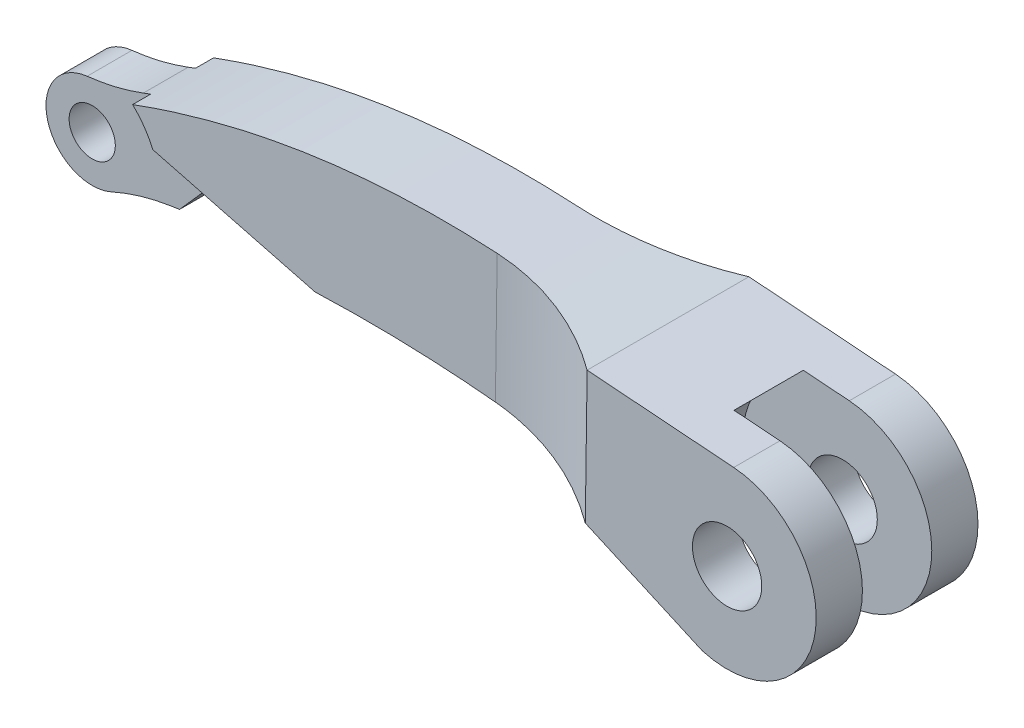
ISO-10303-21;
HEADER;
FILE_DESCRIPTION(('STEP AP214'),'2;1');
FILE_NAME('part.step','',(''),(''),'','','');
FILE_SCHEMA(('AUTOMOTIVE_DESIGN { 1 0 10303 214 1 1 1 1 }'));
ENDSEC;
DATA;
#1=APPLICATION_CONTEXT('core data for automotive mechanical design processes');
#2=APPLICATION_PROTOCOL_DEFINITION('international standard','automotive_design',2000,#1);
#3=PRODUCT_CONTEXT('',#1,'mechanical');
#4=PRODUCT('Part','Part','',(#3));
#5=PRODUCT_RELATED_PRODUCT_CATEGORY('part','',(#4));
#6=PRODUCT_DEFINITION_FORMATION('','',#4);
#7=PRODUCT_DEFINITION_CONTEXT('part definition',#1,'design');
#8=PRODUCT_DEFINITION('design','',#6,#7);
#9=PRODUCT_DEFINITION_SHAPE('','',#8);
#10=(LENGTH_UNIT() NAMED_UNIT(*) SI_UNIT(.MILLI.,.METRE.));
#11=(NAMED_UNIT(*) PLANE_ANGLE_UNIT() SI_UNIT($,.RADIAN.));
#12=(NAMED_UNIT(*) SI_UNIT($,.STERADIAN.) SOLID_ANGLE_UNIT());
#13=UNCERTAINTY_MEASURE_WITH_UNIT(LENGTH_MEASURE(1.E-05),#10,'distance_accuracy_value','');
#14=(GEOMETRIC_REPRESENTATION_CONTEXT(3) GLOBAL_UNCERTAINTY_ASSIGNED_CONTEXT((#13)) GLOBAL_UNIT_ASSIGNED_CONTEXT((#10,
#11,#12)) REPRESENTATION_CONTEXT('',''));
#15=CARTESIAN_POINT('',(0.,0.,0.));
#16=DIRECTION('',(0.,0.,1.));
#17=DIRECTION('',(1.,0.,0.));
#18=AXIS2_PLACEMENT_3D('',#15,#16,#17);
#19=CARTESIAN_POINT('',(1.43527791880468,-1.39283067735877,1.75));
#20=CARTESIAN_POINT('',(15.4492029121807,1.18573782839704,1.75));
#21=CARTESIAN_POINT('',(28.4490744755167,-2.56800117163254,1.75));
#22=B_SPLINE_CURVE_WITH_KNOTS('',2,(#19,#20,#21),.UNSPECIFIED.,.F.,.F.,(3,3),(0.,1.),.UNSPECIFIED.);
#23=DIRECTION('',(0.,0.,-1.));
#24=VECTOR('',#23,1.);
#25=SURFACE_OF_LINEAR_EXTRUSION('',#22,#24);
#26=CARTESIAN_POINT('',(1.43527791880468,-1.39283067735877,0.97));
#27=CARTESIAN_POINT('',(15.4492029121807,1.18573782839704,0.97));
#28=CARTESIAN_POINT('',(28.4490744755167,-2.56800117163254,0.97));
#29=B_SPLINE_CURVE_WITH_KNOTS('',2,(#26,#27,#28),.UNSPECIFIED.,.F.,.F.,(3,3),(0.,1.),.UNSPECIFIED.);
#30=CARTESIAN_POINT('',(8.42888479504866,-0.495717450284261,0.97));
#31=VERTEX_POINT('',#30);
#32=CARTESIAN_POINT('',(10.4244365086683,-0.386098791694974,0.97));
#33=VERTEX_POINT('',#32);
#34=EDGE_CURVE('E263',#31,#33,#29,.T.);
#35=ORIENTED_EDGE('',*,*,#34,.F.);
#36=DIRECTION('',(0.,0.,-1.));
#37=VECTOR('',#36,1.);
#38=CARTESIAN_POINT('',(8.42888479504866,-0.495717450284261,1.03));
#39=LINE('',#38,#37);
#40=CARTESIAN_POINT('',(8.42888479504866,-0.495717450284261,-0.97));
#41=VERTEX_POINT('',#40);
#42=EDGE_CURVE('E198',#31,#41,#39,.T.);
#43=ORIENTED_EDGE('',*,*,#42,.T.);
#44=CARTESIAN_POINT('',(1.43527791880468,-1.39283067735877,-0.97));
#45=CARTESIAN_POINT('',(15.4492029121807,1.18573782839704,-0.97));
#46=CARTESIAN_POINT('',(28.4490744755167,-2.56800117163254,-0.97));
#47=B_SPLINE_CURVE_WITH_KNOTS('',2,(#44,#45,#46),.UNSPECIFIED.,.F.,.F.,(3,3),(0.,1.),.UNSPECIFIED.);
#48=CARTESIAN_POINT('',(10.4244365086683,-0.386098791694975,-0.97));
#49=VERTEX_POINT('',#48);
#50=EDGE_CURVE('E209',#41,#49,#47,.T.);
#51=ORIENTED_EDGE('',*,*,#50,.T.);
#52=DIRECTION('',(0.,0.,-1.));
#53=VECTOR('',#52,1.);
#54=CARTESIAN_POINT('',(10.4244365086683,-0.386098791694975,8.2389131509684));
#55=LINE('',#54,#53);
#56=CARTESIAN_POINT('',(10.4244365086683,-0.386098791694975,-1.75));
#57=VERTEX_POINT('',#56);
#58=EDGE_CURVE('E229',#49,#57,#55,.T.);
#59=ORIENTED_EDGE('',*,*,#58,.T.);
#60=CARTESIAN_POINT('',(1.43527791880468,-1.39283067735877,-1.75));
#61=CARTESIAN_POINT('',(15.4492029121807,1.18573782839704,-1.75));
#62=CARTESIAN_POINT('',(28.4490744755167,-2.56800117163254,-1.75));
#63=B_SPLINE_CURVE_WITH_KNOTS('',2,(#60,#61,#62),.UNSPECIFIED.,.F.,.F.,(3,3),(0.,1.),.UNSPECIFIED.);
#64=CARTESIAN_POINT('',(18.2249382252607,-0.609983249100861,-1.75));
#65=VERTEX_POINT('',#64);
#66=EDGE_CURVE('E350',#57,#65,#63,.T.);
#67=ORIENTED_EDGE('',*,*,#66,.T.);
#68=CARTESIAN_POINT('',(18.2249382252607,-0.60998324910088,-1.75));
#69=CARTESIAN_POINT('',(18.5100813748935,-0.637652814010313,-1.74996571468664));
#70=CARTESIAN_POINT('',(18.794998784143,-0.667532379102233,-1.76222427364251));
#71=CARTESIAN_POINT('',(19.3622885730239,-0.731352980382945,-1.81098690911005));
#72=CARTESIAN_POINT('',(19.6446610106415,-0.765293923781831,-1.84749043178612));
#73=CARTESIAN_POINT('',(20.1979264498915,-0.836004063511133,-1.94321695448715));
#74=CARTESIAN_POINT('',(20.4689312656351,-0.872683713069182,-2.00186206267157));
#75=CARTESIAN_POINT('',(21.0046764787895,-0.94910037242713,-2.14138486287721));
#76=CARTESIAN_POINT('',(21.2694179966082,-0.988836829920536,-2.22225854538438));
#77=CARTESIAN_POINT('',(21.7349686760978,-1.0620266223372,-2.38593100039942));
#78=CARTESIAN_POINT('',(21.9373175064972,-1.09500092125032,-2.46460099010984));
#79=CARTESIAN_POINT('',(22.3362719142062,-1.16219708544243,-2.63490228385438));
#80=CARTESIAN_POINT('',(22.5328777145632,-1.19641890215405,-2.72653308370771));
#81=CARTESIAN_POINT('',(22.923368587076,-1.26646772014086,-2.92428497307736));
#82=CARTESIAN_POINT('',(23.1171238156068,-1.30231306104497,-3.03065590264019));
#83=CARTESIAN_POINT('',(23.4970840179918,-1.37459276870234,-3.25599802441865));
#84=CARTESIAN_POINT('',(23.6832880042539,-1.41102721163556,-3.37497085747705));
#85=CARTESIAN_POINT('',(23.8653099384864,-1.44756657474494,-3.50000000000636));
#86=B_SPLINE_CURVE_WITH_KNOTS('',3,(#68,#69,#70,#71,#72,#73,#74,#75,#76,#77,#78,#79,#80,#81,#82,
#83,#84,#85),.UNSPECIFIED.,.F.,.F.,(4,2,2,2,2,2,2,2,4),(0.,0.859163300575668,1.71830697567949,
2.55642429826319,3.39439054321632,4.05273130918115,4.71104647246186,5.38232695563261,
6.05369495120699),.UNSPECIFIED.);
#87=CARTESIAN_POINT('',(23.865309938476,-1.44756657482525,-3.5));
#88=VERTEX_POINT('',#87);
#89=EDGE_CURVE('E380',#65,#88,#86,.T.);
#90=ORIENTED_EDGE('',*,*,#89,.T.);
#91=DIRECTION('',(0.,0.,-1.));
#92=VECTOR('',#91,1.);
#93=CARTESIAN_POINT('',(23.865309938476,-1.44756657482525,3.5));
#94=LINE('',#93,#92);
#95=CARTESIAN_POINT('',(23.865309938476,-1.44756657482525,3.5));
#96=VERTEX_POINT('',#95);
#97=EDGE_CURVE('E344',#96,#88,#94,.T.);
#98=ORIENTED_EDGE('',*,*,#97,.F.);
#99=CARTESIAN_POINT('',(23.865309938476,-1.44756657482525,3.5));
#100=CARTESIAN_POINT('',(23.6312489811901,-1.40057307605156,3.33920757578725));
#101=CARTESIAN_POINT('',(23.390253261689,-1.35376072279584,3.18844433669338));
#102=CARTESIAN_POINT('',(22.8960566636482,-1.26127011249579,2.90793294190109));
#103=CARTESIAN_POINT('',(22.6428534281999,-1.21559207705461,2.77818886563256));
#104=CARTESIAN_POINT('',(22.1323842882194,-1.12726570964828,2.54366948807793));
#105=CARTESIAN_POINT('',(21.875373393739,-1.08457040307792,2.43835640605782));
#106=CARTESIAN_POINT('',(21.3531422895609,-1.00165956222023,2.24947957211496));
#107=CARTESIAN_POINT('',(21.0879240969148,-0.961443425800618,2.16591052306922));
#108=CARTESIAN_POINT('',(20.6108688013275,-0.892675616028555,2.03728829892872));
#109=CARTESIAN_POINT('',(20.4003013260282,-0.863521185971003,1.98780218985252));
#110=CARTESIAN_POINT('',(19.9761294526793,-0.80727194822316,1.90259590723777));
#111=CARTESIAN_POINT('',(19.7625252232467,-0.780177026703985,1.86687497245429));
#112=CARTESIAN_POINT('',(19.3289619338518,-0.727730828653767,1.80883821296601));
#113=CARTESIAN_POINT('',(19.1089604074446,-0.702424178037209,1.78679907092545));
#114=CARTESIAN_POINT('',(18.6676634066786,-0.654298432283651,1.75737237769931));
#115=CARTESIAN_POINT('',(18.4463676735896,-0.631479853798667,1.749987864115));
#116=CARTESIAN_POINT('',(18.2249382252607,-0.609983249100862,1.75));
#117=B_SPLINE_CURVE_WITH_KNOTS('',3,(#99,#100,#101,#102,#103,#104,#105,#106,#107,#108,#109,#110,
#111,#112,#113,#114,#115,#116),.UNSPECIFIED.,.F.,.F.,(4,2,2,2,2,2,2,2,4),(0.,0.863254027551366,
1.72667539651197,2.56876060100889,3.41064047036145,4.06498139485932,4.71928612764575,
5.38642495336616,6.05370204872468),.UNSPECIFIED.);
#118=CARTESIAN_POINT('',(18.2249382252607,-0.609983249100861,1.75));
#119=VERTEX_POINT('',#118);
#120=EDGE_CURVE('E388',#96,#119,#117,.T.);
#121=ORIENTED_EDGE('',*,*,#120,.T.);
#122=CARTESIAN_POINT('',(10.4244365086683,-0.386098791694974,1.75));
#123=VERTEX_POINT('',#122);
#124=EDGE_CURVE('E351',#123,#119,#22,.T.);
#125=ORIENTED_EDGE('',*,*,#124,.F.);
#126=DIRECTION('',(0.,0.,1.));
#127=VECTOR('',#126,1.);
#128=CARTESIAN_POINT('',(10.4244365086683,-0.386098791694974,-8.23891315096839));
#129=LINE('',#128,#127);
#130=EDGE_CURVE('E219',#33,#123,#129,.T.);
#131=ORIENTED_EDGE('',*,*,#130,.F.);
#132=EDGE_LOOP('',(#35,#43,#51,#59,#67,#90,#98,#121,#125,#131));
#133=FACE_BOUND('',#132,.T.);
#134=ADVANCED_FACE('F35',(#133),#25,.F.);
#135=CARTESIAN_POINT('',(3.40689588835682,-1.06061944503923,-0.97));
#136=VERTEX_POINT('',#135);
#137=CARTESIAN_POINT('',(3.77812816694394,-1.00494890536289,-0.97));
#138=VERTEX_POINT('',#137);
#139=EDGE_CURVE('E246',#136,#138,#47,.T.);
#140=ORIENTED_EDGE('',*,*,#139,.T.);
#141=DIRECTION('',(0.,0.,-1.));
#142=VECTOR('',#141,1.);
#143=CARTESIAN_POINT('',(3.77812817240031,-1.00494890449315,1.03));
#144=LINE('',#143,#142);
#145=CARTESIAN_POINT('',(3.77812817240031,-1.00494890449315,0.97));
#146=VERTEX_POINT('',#145);
#147=EDGE_CURVE('E50',#146,#138,#144,.T.);
#148=ORIENTED_EDGE('',*,*,#147,.F.);
#149=CARTESIAN_POINT('',(3.40689588835682,-1.06061944503923,0.97));
#150=VERTEX_POINT('',#149);
#151=EDGE_CURVE('E264',#150,#146,#29,.T.);
#152=ORIENTED_EDGE('',*,*,#151,.F.);
#153=DIRECTION('',(0.,0.,-1.));
#154=VECTOR('',#153,1.);
#155=CARTESIAN_POINT('',(3.40689588835716,-1.06061944503918,1.75));
#156=LINE('',#155,#154);
#157=EDGE_CURVE('E449',#150,#136,#156,.T.);
#158=ORIENTED_EDGE('',*,*,#157,.T.);
#159=EDGE_LOOP('',(#140,#148,#152,#158));
#160=FACE_BOUND('',#159,.T.);
#161=ADVANCED_FACE('F366',(#160),#25,.F.);
#162=CARTESIAN_POINT('',(29.5303772913072,2.96301442984674,1.75));
#163=CARTESIAN_POINT('',(13.9500427176749,7.64913489793884,1.75));
#164=CARTESIAN_POINT('',(0.579938429830933,1.9140719468205,1.75));
#165=B_SPLINE_CURVE_WITH_KNOTS('',2,(#162,#163,#164),.UNSPECIFIED.,.F.,.F.,(3,3),(0.,1.),.UNSPECIFIED.);
#166=DIRECTION('',(0.,0.,-1.));
#167=VECTOR('',#166,1.);
#168=SURFACE_OF_LINEAR_EXTRUSION('',#165,#167);
#169=DIRECTION('',(0.,0.,-1.));
#170=VECTOR('',#169,1.);
#171=CARTESIAN_POINT('',(2.52849769730973,2.69024543517786,1.75));
#172=LINE('',#171,#170);
#173=CARTESIAN_POINT('',(2.52849769730973,2.69024543517786,-0.97));
#174=VERTEX_POINT('',#173);
#175=CARTESIAN_POINT('',(2.52849769730973,2.69024543517786,-1.75));
#176=VERTEX_POINT('',#175);
#177=EDGE_CURVE('E11',#174,#176,#172,.T.);
#178=ORIENTED_EDGE('',*,*,#177,.F.);
#179=CARTESIAN_POINT('',(29.5303772913072,2.96301442984674,-0.97));
#180=CARTESIAN_POINT('',(13.9500427176749,7.64913489793884,-0.97));
#181=CARTESIAN_POINT('',(0.579938429830933,1.9140719468205,-0.97));
#182=B_SPLINE_CURVE_WITH_KNOTS('',2,(#179,#180,#181),.UNSPECIFIED.,.F.,.F.,(3,3),(0.,1.),.UNSPECIFIED.);
#183=CARTESIAN_POINT('',(2.21234952234116,2.5723413782809,-0.97));
#184=VERTEX_POINT('',#183);
#185=EDGE_CURVE('E43',#174,#184,#182,.T.);
#186=ORIENTED_EDGE('',*,*,#185,.T.);
#187=DIRECTION('',(0.,0.,-1.));
#188=VECTOR('',#187,1.);
#189=CARTESIAN_POINT('',(2.21234952234116,2.5723413782809,-1.75));
#190=LINE('',#189,#188);
#191=CARTESIAN_POINT('',(2.21234952234112,2.57234137828089,0.97));
#192=VERTEX_POINT('',#191);
#193=EDGE_CURVE('E445',#184,#192,#190,.F.);
#194=ORIENTED_EDGE('',*,*,#193,.T.);
#195=CARTESIAN_POINT('',(29.5303772913072,2.96301442984674,0.97));
#196=CARTESIAN_POINT('',(13.9500427176749,7.64913489793884,0.97));
#197=CARTESIAN_POINT('',(0.579938429830933,1.9140719468205,0.97));
#198=B_SPLINE_CURVE_WITH_KNOTS('',2,(#195,#196,#197),.UNSPECIFIED.,.F.,.F.,(3,3),(0.,1.),.UNSPECIFIED.);
#199=CARTESIAN_POINT('',(2.52849769730973,2.69024543517786,0.97));
#200=VERTEX_POINT('',#199);
#201=EDGE_CURVE('E274',#200,#192,#198,.T.);
#202=ORIENTED_EDGE('',*,*,#201,.F.);
#203=DIRECTION('',(0.,0.,-1.));
#204=VECTOR('',#203,1.);
#205=CARTESIAN_POINT('',(2.52849769730973,2.69024543517786,1.75));
#206=LINE('',#205,#204);
#207=CARTESIAN_POINT('',(2.52849769730973,2.69024543517786,1.75));
#208=VERTEX_POINT('',#207);
#209=EDGE_CURVE('E439',#200,#208,#206,.F.);
#210=ORIENTED_EDGE('',*,*,#209,.T.);
#211=CARTESIAN_POINT('',(18.3019333761459,5.00417222313445,1.75));
#212=VERTEX_POINT('',#211);
#213=EDGE_CURVE('E356',#212,#208,#165,.T.);
#214=ORIENTED_EDGE('',*,*,#213,.F.);
#215=CARTESIAN_POINT('',(18.3019333761459,5.00417222313458,1.75));
#216=CARTESIAN_POINT('',(18.4902403894861,4.9935940966374,1.74999295330289));
#217=CARTESIAN_POINT('',(18.6784731754754,4.98175231580647,1.7553258415074));
#218=CARTESIAN_POINT('',(19.05415443212,4.95564630379065,1.77660110500973));
#219=CARTESIAN_POINT('',(19.2416029661215,4.94138227228508,1.79254260609764));
#220=CARTESIAN_POINT('',(19.6151086581629,4.91053504099818,1.83496445782946));
#221=CARTESIAN_POINT('',(19.801165834318,4.89395187146695,1.861444671018));
#222=CARTESIAN_POINT('',(20.1667202396815,4.85904377050261,1.92404406387844));
#223=CARTESIAN_POINT('',(20.3462660860007,4.84077188216074,1.95990941470664));
#224=CARTESIAN_POINT('',(20.7029061839822,4.80231074033884,2.04141314806348));
#225=CARTESIAN_POINT('',(20.880000592638,4.7821216102987,2.08705090164188));
#226=CARTESIAN_POINT('',(21.2311889804256,4.74000446924392,2.18792321369633));
#227=CARTESIAN_POINT('',(21.4052834171068,4.71807672630807,2.24315629421575));
#228=CARTESIAN_POINT('',(21.7853430626307,4.66801645216577,2.37532673374674));
#229=CARTESIAN_POINT('',(21.9905257423564,4.63953343292823,2.4543923063396));
#230=CARTESIAN_POINT('',(22.3949942809888,4.5806876466945,2.62580977158944));
#231=CARTESIAN_POINT('',(22.5942797234194,4.55032474740301,2.71816259993498));
#232=CARTESIAN_POINT('',(22.990105056686,4.48748661106856,2.91773144186189));
#233=CARTESIAN_POINT('',(23.1865074037723,4.4549810313825,3.0252107976485));
#234=CARTESIAN_POINT('',(23.5715212973184,4.38887391492037,3.25306282506067));
#235=CARTESIAN_POINT('',(23.7601320460989,4.35527226655934,3.37343681228758));
#236=CARTESIAN_POINT('',(23.9444275451794,4.32134925321462,3.5));
#237=B_SPLINE_CURVE_WITH_KNOTS('',3,(#215,#216,#217,#218,#219,#220,#221,#222,#223,#224,#225,
#226,#227,#228,#229,#230,#231,#232,#233,#234,#235,#236),.UNSPECIFIED.,.F.,.F.,(4,2,2,2,2,2,2,2,
2,2,4),(0.,0.565727155773413,1.13140769819131,1.69708086273668,2.24880303343014,
2.80048970604203,3.35209147824214,4.01676768628887,4.68149072376509,5.35968833776918,
6.03795521230591),.UNSPECIFIED.);
#238=CARTESIAN_POINT('',(23.9444275451802,4.32134925326647,3.5));
#239=VERTEX_POINT('',#238);
#240=EDGE_CURVE('E396',#212,#239,#237,.T.);
#241=ORIENTED_EDGE('',*,*,#240,.T.);
#242=DIRECTION('',(0.,0.,-1.));
#243=VECTOR('',#242,1.);
#244=CARTESIAN_POINT('',(23.9444275451794,4.32134925321463,1.75));
#245=LINE('',#244,#243);
#246=CARTESIAN_POINT('',(23.9444275451794,4.32134925321463,-3.5));
#247=VERTEX_POINT('',#246);
#248=EDGE_CURVE('E746',#247,#239,#245,.F.);
#249=ORIENTED_EDGE('',*,*,#248,.F.);
#250=CARTESIAN_POINT('',(23.9444275451794,4.32134925321463,-3.5));
#251=CARTESIAN_POINT('',(23.7124154353925,4.36406166581813,-3.34065166766199));
#252=CARTESIAN_POINT('',(23.4735480953779,4.40625842083292,-3.19112608994191));
#253=CARTESIAN_POINT('',(22.983710886676,4.48874491491752,-2.91267196138038));
#254=CARTESIAN_POINT('',(22.7327383230078,4.5290342253407,-2.78374802488501));
#255=CARTESIAN_POINT('',(22.2268033329024,4.605838747382,-2.55047152161493));
#256=CARTESIAN_POINT('',(21.9720972062158,4.64242309821263,-2.44558558209536));
#257=CARTESIAN_POINT('',(21.4545024685279,4.71217498769385,-2.25716276871446));
#258=CARTESIAN_POINT('',(21.1916158724,4.7453433591709,-2.17362068376488));
#259=CARTESIAN_POINT('',(20.7147329930417,4.80112812365867,-2.04361360729314));
#260=CARTESIAN_POINT('',(20.5019320843942,4.82450481264482,-1.99305129168335));
#261=CARTESIAN_POINT('',(20.0731996059385,4.86841469352092,-1.90598827725654));
#262=CARTESIAN_POINT('',(19.8572684138487,4.88894822537935,-1.86948589630132));
#263=CARTESIAN_POINT('',(19.4188095636705,4.92731339264264,-1.81015674655511));
#264=CARTESIAN_POINT('',(19.1962368548286,4.94508192358036,-1.78762175293336));
#265=CARTESIAN_POINT('',(18.7497897183721,4.97722289334551,-1.75753478630959));
#266=CARTESIAN_POINT('',(18.5259150211683,4.99159460116861,-1.74998603580078));
#267=CARTESIAN_POINT('',(18.3019333761459,5.00417222313445,-1.75));
#268=B_SPLINE_CURVE_WITH_KNOTS('',3,(#250,#251,#252,#253,#254,#255,#256,#257,#258,#259,#260,
#261,#262,#263,#264,#265,#266,#267),.UNSPECIFIED.,.F.,.F.,(4,2,2,2,2,2,2,2,4),(0.,
0.853827527710311,1.707846028072,2.54052980299423,3.37301008401443,4.03245797901632,
4.69182695279135,5.36454274256232,6.03740317080942),.UNSPECIFIED.);
#269=CARTESIAN_POINT('',(18.3019333761459,5.00417222313445,-1.75));
#270=VERTEX_POINT('',#269);
#271=EDGE_CURVE('E760',#247,#270,#268,.T.);
#272=ORIENTED_EDGE('',*,*,#271,.T.);
#273=CARTESIAN_POINT('',(29.5303772913072,2.96301442984674,-1.75));
#274=CARTESIAN_POINT('',(13.9500427176749,7.64913489793884,-1.75));
#275=CARTESIAN_POINT('',(0.579938429830933,1.9140719468205,-1.75));
#276=B_SPLINE_CURVE_WITH_KNOTS('',2,(#273,#274,#275),.UNSPECIFIED.,.F.,.F.,(3,3),(0.,1.),.UNSPECIFIED.);
#277=EDGE_CURVE('E357',#270,#176,#276,.T.);
#278=ORIENTED_EDGE('',*,*,#277,.T.);
#279=EDGE_LOOP('',(#178,#186,#194,#202,#210,#214,#241,#249,#272,#278));
#280=FACE_BOUND('',#279,.T.);
#281=ADVANCED_FACE('F371',(#280),#168,.F.);
#282=CARTESIAN_POINT('',(0.,0.,1.75));
#283=DIRECTION('',(0.,0.,-1.));
#284=DIRECTION('',(-1.,0.,0.));
#285=AXIS2_PLACEMENT_3D('',#282,#283,#284);
#286=CYLINDRICAL_SURFACE('',#285,2.);
#287=DIRECTION('',(0.,0.,-1.));
#288=VECTOR('',#287,1.);
#289=CARTESIAN_POINT('',(-0.220317652310451,1.98782799358506,1.75));
#290=LINE('',#289,#288);
#291=CARTESIAN_POINT('',(-0.220317652310451,1.98782799358506,0.97));
#292=VERTEX_POINT('',#291);
#293=CARTESIAN_POINT('',(-0.220317652310452,1.98782799358506,-0.97));
#294=VERTEX_POINT('',#293);
#295=EDGE_CURVE('E447',#292,#294,#290,.T.);
#296=ORIENTED_EDGE('',*,*,#295,.T.);
#297=CARTESIAN_POINT('',(0.,0.,-0.97));
#298=DIRECTION('',(0.,0.,1.));
#299=DIRECTION('',(1.,0.,0.));
#300=AXIS2_PLACEMENT_3D('',#297,#298,#299);
#301=CIRCLE('',#300,2.);
#302=CARTESIAN_POINT('',(0.81974354251078,-1.82428630552111,-0.97));
#303=VERTEX_POINT('',#302);
#304=EDGE_CURVE('E241',#294,#303,#301,.T.);
#305=ORIENTED_EDGE('',*,*,#304,.T.);
#306=DIRECTION('',(0.,0.,-1.));
#307=VECTOR('',#306,1.);
#308=CARTESIAN_POINT('',(0.81974354251078,-1.82428630552111,1.75));
#309=LINE('',#308,#307);
#310=CARTESIAN_POINT('',(0.81974354251078,-1.82428630552111,0.97));
#311=VERTEX_POINT('',#310);
#312=EDGE_CURVE('E395',#303,#311,#309,.F.);
#313=ORIENTED_EDGE('',*,*,#312,.T.);
#314=CARTESIAN_POINT('',(0.,0.,0.97));
#315=DIRECTION('',(0.,0.,1.));
#316=DIRECTION('',(1.,0.,0.));
#317=AXIS2_PLACEMENT_3D('',#314,#315,#316);
#318=CIRCLE('',#317,2.);
#319=EDGE_CURVE('E259',#292,#311,#318,.T.);
#320=ORIENTED_EDGE('',*,*,#319,.F.);
#321=EDGE_LOOP('',(#296,#305,#313,#320));
#322=FACE_BOUND('',#321,.T.);
#323=ADVANCED_FACE('F418',(#322),#286,.T.);
#324=CARTESIAN_POINT('',(0.,0.,1.75));
#325=DIRECTION('',(0.,0.,-1.));
#326=DIRECTION('',(-1.,0.,0.));
#327=AXIS2_PLACEMENT_3D('',#324,#325,#326);
#328=CYLINDRICAL_SURFACE('',#327,0.999999999999999);
#329=CARTESIAN_POINT('',(0.,0.,-0.97));
#330=DIRECTION('',(0.,0.,1.));
#331=DIRECTION('',(1.,0.,0.));
#332=AXIS2_PLACEMENT_3D('',#329,#330,#331);
#333=CIRCLE('',#332,0.999999999999999);
#334=CARTESIAN_POINT('',(0.999999999999999,0.,-0.97));
#335=VERTEX_POINT('',#334);
#336=EDGE_CURVE('E250',#335,#335,#333,.T.);
#337=ORIENTED_EDGE('',*,*,#336,.F.);
#338=EDGE_LOOP('',(#337));
#339=FACE_BOUND('',#338,.T.);
#340=CARTESIAN_POINT('',(0.,0.,0.97));
#341=DIRECTION('',(0.,0.,1.));
#342=DIRECTION('',(1.,0.,0.));
#343=AXIS2_PLACEMENT_3D('',#340,#341,#342);
#344=CIRCLE('',#343,0.999999999999999);
#345=CARTESIAN_POINT('',(0.999999999999999,0.,0.97));
#346=VERTEX_POINT('',#345);
#347=EDGE_CURVE('E279',#346,#346,#344,.T.);
#348=ORIENTED_EDGE('',*,*,#347,.T.);
#349=EDGE_LOOP('',(#348));
#350=FACE_BOUND('',#349,.T.);
#351=ADVANCED_FACE('F410',(#339,#350),#328,.F.);
#352=CARTESIAN_POINT('',(-1.32190591386271,11.9269679615104,0.));
#353=DIRECTION('',(0.,0.,-1.));
#354=DIRECTION('',(-1.,0.,0.));
#355=AXIS2_PLACEMENT_3D('',#352,#353,#354);
#356=CYLINDRICAL_SURFACE('',#355,10.);
#357=ORIENTED_EDGE('',*,*,#193,.F.);
#358=CARTESIAN_POINT('',(-1.32190591386271,11.9269679615104,-0.97));
#359=DIRECTION('',(0.,0.,1.));
#360=DIRECTION('',(1.,0.,0.));
#361=AXIS2_PLACEMENT_3D('',#358,#359,#360);
#362=CIRCLE('',#361,10.);
#363=EDGE_CURVE('E237',#184,#294,#362,.F.);
#364=ORIENTED_EDGE('',*,*,#363,.T.);
#365=ORIENTED_EDGE('',*,*,#295,.F.);
#366=CARTESIAN_POINT('',(-1.32190591386271,11.9269679615104,0.97));
#367=DIRECTION('',(0.,0.,1.));
#368=DIRECTION('',(1.,0.,0.));
#369=AXIS2_PLACEMENT_3D('',#366,#367,#368);
#370=CIRCLE('',#369,10.);
#371=EDGE_CURVE('E269',#192,#292,#370,.F.);
#372=ORIENTED_EDGE('',*,*,#371,.F.);
#373=EDGE_LOOP('',(#357,#364,#365,#372));
#374=FACE_BOUND('',#373,.T.);
#375=ADVANCED_FACE('F407',(#374),#356,.F.);
#376=CARTESIAN_POINT('',(4.91846125506468,-10.9457178331267,0.));
#377=DIRECTION('',(0.,0.,-1.));
#378=DIRECTION('',(-1.,0.,0.));
#379=AXIS2_PLACEMENT_3D('',#376,#377,#378);
#380=CYLINDRICAL_SURFACE('',#379,10.);
#381=ORIENTED_EDGE('',*,*,#312,.F.);
#382=CARTESIAN_POINT('',(4.91846125506468,-10.9457178331267,-0.97));
#383=DIRECTION('',(0.,0.,1.));
#384=DIRECTION('',(1.,0.,0.));
#385=AXIS2_PLACEMENT_3D('',#382,#383,#384);
#386=CIRCLE('',#385,10.);
#387=EDGE_CURVE('E244',#303,#136,#386,.F.);
#388=ORIENTED_EDGE('',*,*,#387,.T.);
#389=ORIENTED_EDGE('',*,*,#157,.F.);
#390=CARTESIAN_POINT('',(4.91846125506468,-10.9457178331267,0.97));
#391=DIRECTION('',(0.,0.,1.));
#392=DIRECTION('',(1.,0.,0.));
#393=AXIS2_PLACEMENT_3D('',#390,#391,#392);
#394=CIRCLE('',#393,10.);
#395=EDGE_CURVE('E454',#311,#150,#394,.F.);
#396=ORIENTED_EDGE('',*,*,#395,.F.);
#397=EDGE_LOOP('',(#381,#388,#389,#396));
#398=FACE_BOUND('',#397,.T.);
#399=ADVANCED_FACE('F37',(#398),#380,.F.);
#400=CARTESIAN_POINT('',(30.,0.,3.5));
#401=DIRECTION('',(0.,0.,-1.));
#402=DIRECTION('',(-1.,0.,0.));
#403=AXIS2_PLACEMENT_3D('',#400,#401,#402);
#404=CYLINDRICAL_SURFACE('',#403,3.85694958374146);
#405=CARTESIAN_POINT('',(30.,0.,-1.5));
#406=DIRECTION('',(0.,0.,1.));
#407=DIRECTION('',(1.,0.,0.));
#408=AXIS2_PLACEMENT_3D('',#405,#406,#407);
#409=CIRCLE('',#408,3.85694958374146);
#410=CARTESIAN_POINT('',(28.92532622388,-3.7042052273657,-1.5));
#411=VERTEX_POINT('',#410);
#412=CARTESIAN_POINT('',(30.2880988867762,3.8461746090059,-1.5));
#413=VERTEX_POINT('',#412);
#414=EDGE_CURVE('E304',#411,#413,#409,.T.);
#415=ORIENTED_EDGE('',*,*,#414,.F.);
#416=DIRECTION('',(0.,0.,-1.));
#417=VECTOR('',#416,1.);
#418=CARTESIAN_POINT('',(28.92532622388,-3.7042052273657,3.5));
#419=LINE('',#418,#417);
#420=CARTESIAN_POINT('',(28.92532622388,-3.7042052273657,-3.5));
#421=VERTEX_POINT('',#420);
#422=EDGE_CURVE('E330',#411,#421,#419,.T.);
#423=ORIENTED_EDGE('',*,*,#422,.T.);
#424=CARTESIAN_POINT('',(30.,0.,-3.5));
#425=DIRECTION('',(0.,0.,1.));
#426=DIRECTION('',(1.,0.,0.));
#427=AXIS2_PLACEMENT_3D('',#424,#425,#426);
#428=CIRCLE('',#427,3.85694958374146);
#429=CARTESIAN_POINT('',(30.2880988867762,3.8461746090059,-3.5));
#430=VERTEX_POINT('',#429);
#431=EDGE_CURVE('E315',#421,#430,#428,.T.);
#432=ORIENTED_EDGE('',*,*,#431,.T.);
#433=DIRECTION('',(0.,0.,-1.));
#434=VECTOR('',#433,1.);
#435=CARTESIAN_POINT('',(30.2880988867762,3.8461746090059,3.5));
#436=LINE('',#435,#434);
#437=EDGE_CURVE('E346',#413,#430,#436,.T.);
#438=ORIENTED_EDGE('',*,*,#437,.F.);
#439=EDGE_LOOP('',(#415,#423,#432,#438));
#440=FACE_BOUND('',#439,.T.);
#441=ADVANCED_FACE('F416',(#440),#404,.T.);
#442=CARTESIAN_POINT('',(30.2880988867762,3.8461746090059,3.5));
#443=DIRECTION('',(-0.0746960468428975,-0.997206348047406,0.));
#444=DIRECTION('',(0.997206348047406,-0.0746960468428975,0.));
#445=AXIS2_PLACEMENT_3D('',#442,#443,#444);
#446=PLANE('',#445);
#447=DIRECTION('',(-0.997206348047406,0.0746960468428975,0.));
#448=VECTOR('',#447,1.);
#449=CARTESIAN_POINT('',(30.2880988867762,3.8461746090059,-1.5));
#450=LINE('',#449,#448);
#451=CARTESIAN_POINT('',(28.2994147796363,3.99513760098195,-1.5));
#452=VERTEX_POINT('',#451);
#453=EDGE_CURVE('E306',#413,#452,#450,.T.);
#454=ORIENTED_EDGE('',*,*,#453,.F.);
#455=ORIENTED_EDGE('',*,*,#437,.T.);
#456=DIRECTION('',(-0.997206348047406,0.0746960468428975,0.));
#457=VECTOR('',#456,1.);
#458=CARTESIAN_POINT('',(30.2880988867762,3.8461746090059,-3.5));
#459=LINE('',#458,#457);
#460=EDGE_CURVE('E333',#430,#247,#459,.T.);
#461=ORIENTED_EDGE('',*,*,#460,.T.);
#462=ORIENTED_EDGE('',*,*,#248,.T.);
#463=DIRECTION('',(-0.997206348047406,0.0746960468428975,0.));
#464=VECTOR('',#463,1.);
#465=CARTESIAN_POINT('',(30.2880988867762,3.8461746090059,3.5));
#466=LINE('',#465,#464);
#467=CARTESIAN_POINT('',(30.2880988867762,3.8461746090059,3.5));
#468=VERTEX_POINT('',#467);
#469=EDGE_CURVE('E321',#468,#239,#466,.T.);
#470=ORIENTED_EDGE('',*,*,#469,.F.);
#471=CARTESIAN_POINT('',(30.2880988867762,3.8461746090059,1.5));
#472=VERTEX_POINT('',#471);
#473=EDGE_CURVE('E347',#468,#472,#436,.T.);
#474=ORIENTED_EDGE('',*,*,#473,.T.);
#475=DIRECTION('',(-0.997206348047406,0.0746960468428975,0.));
#476=VECTOR('',#475,1.);
#477=CARTESIAN_POINT('',(30.2880988867762,3.8461746090059,1.5));
#478=LINE('',#477,#476);
#479=CARTESIAN_POINT('',(28.2994147796363,3.99513760098195,1.5));
#480=VERTEX_POINT('',#479);
#481=EDGE_CURVE('E298',#472,#480,#478,.T.);
#482=ORIENTED_EDGE('',*,*,#481,.T.);
#483=DIRECTION('',(0.,0.,1.));
#484=VECTOR('',#483,1.);
#485=CARTESIAN_POINT('',(28.2994147796363,3.99513760098195,-1.5));
#486=LINE('',#485,#484);
#487=EDGE_CURVE('E308',#480,#452,#486,.F.);
#488=ORIENTED_EDGE('',*,*,#487,.T.);
#489=EDGE_LOOP('',(#454,#455,#461,#462,#470,#474,#482,#488));
#490=FACE_BOUND('',#489,.T.);
#491=ADVANCED_FACE('F495',(#490),#446,.F.);
#492=CARTESIAN_POINT('',(23.865309938476,-1.44756657482525,3.5));
#493=DIRECTION('',(0.407305088937392,0.91329215726716,0.));
#494=DIRECTION('',(-0.91329215726716,0.407305088937392,0.));
#495=AXIS2_PLACEMENT_3D('',#492,#493,#494);
#496=PLANE('',#495);
#497=DIRECTION('',(0.91329215726716,-0.407305088937392,0.));
#498=VECTOR('',#497,1.);
#499=CARTESIAN_POINT('',(23.865309938476,-1.44756657482525,-1.5));
#500=LINE('',#499,#498);
#501=CARTESIAN_POINT('',(26.5598747239536,-2.64927398122692,-1.5));
#502=VERTEX_POINT('',#501);
#503=EDGE_CURVE('E302',#502,#411,#500,.T.);
#504=ORIENTED_EDGE('',*,*,#503,.F.);
#505=DIRECTION('',(0.,0.,1.));
#506=VECTOR('',#505,1.);
#507=CARTESIAN_POINT('',(26.5598747239536,-2.64927398122692,-1.5));
#508=LINE('',#507,#506);
#509=CARTESIAN_POINT('',(26.5598747239536,-2.64927398122692,1.5));
#510=VERTEX_POINT('',#509);
#511=EDGE_CURVE('E749',#502,#510,#508,.T.);
#512=ORIENTED_EDGE('',*,*,#511,.T.);
#513=DIRECTION('',(0.91329215726716,-0.407305088937392,0.));
#514=VECTOR('',#513,1.);
#515=CARTESIAN_POINT('',(23.865309938476,-1.44756657482525,1.5));
#516=LINE('',#515,#514);
#517=CARTESIAN_POINT('',(28.92532622388,-3.7042052273657,1.5));
#518=VERTEX_POINT('',#517);
#519=EDGE_CURVE('E292',#510,#518,#516,.T.);
#520=ORIENTED_EDGE('',*,*,#519,.T.);
#521=CARTESIAN_POINT('',(28.92532622388,-3.7042052273657,3.5));
#522=VERTEX_POINT('',#521);
#523=EDGE_CURVE('E341',#522,#518,#419,.T.);
#524=ORIENTED_EDGE('',*,*,#523,.F.);
#525=DIRECTION('',(0.91329215726716,-0.407305088937392,0.));
#526=VECTOR('',#525,1.);
#527=CARTESIAN_POINT('',(23.865309938476,-1.44756657482525,3.5));
#528=LINE('',#527,#526);
#529=EDGE_CURVE('E328',#96,#522,#528,.T.);
#530=ORIENTED_EDGE('',*,*,#529,.F.);
#531=ORIENTED_EDGE('',*,*,#97,.T.);
#532=DIRECTION('',(0.91329215726716,-0.407305088937392,0.));
#533=VECTOR('',#532,1.);
#534=CARTESIAN_POINT('',(23.865309938476,-1.44756657482525,-3.5));
#535=LINE('',#534,#533);
#536=EDGE_CURVE('E322',#88,#421,#535,.T.);
#537=ORIENTED_EDGE('',*,*,#536,.T.);
#538=ORIENTED_EDGE('',*,*,#422,.F.);
#539=EDGE_LOOP('',(#504,#512,#520,#524,#530,#531,#537,#538));
#540=FACE_BOUND('',#539,.T.);
#541=ADVANCED_FACE('F498',(#540),#496,.F.);
#542=CARTESIAN_POINT('',(30.,0.,1.75));
#543=DIRECTION('',(0.,0.,-1.));
#544=DIRECTION('',(-1.,0.,0.));
#545=AXIS2_PLACEMENT_3D('',#542,#543,#544);
#546=CYLINDRICAL_SURFACE('',#545,1.5);
#547=CARTESIAN_POINT('',(30.,0.,-3.5));
#548=DIRECTION('',(0.,0.,1.));
#549=DIRECTION('',(1.,0.,0.));
#550=AXIS2_PLACEMENT_3D('',#547,#548,#549);
#551=CIRCLE('',#550,1.5);
#552=CARTESIAN_POINT('',(31.5,0.,-3.5));
#553=VERTEX_POINT('',#552);
#554=EDGE_CURVE('E311',#553,#553,#551,.T.);
#555=ORIENTED_EDGE('',*,*,#554,.F.);
#556=EDGE_LOOP('',(#555));
#557=FACE_BOUND('',#556,.T.);
#558=CARTESIAN_POINT('',(30.,0.,-1.5));
#559=DIRECTION('',(0.,0.,1.));
#560=DIRECTION('',(1.,0.,0.));
#561=AXIS2_PLACEMENT_3D('',#558,#559,#560);
#562=CIRCLE('',#561,1.5);
#563=CARTESIAN_POINT('',(31.5,0.,-1.5));
#564=VERTEX_POINT('',#563);
#565=EDGE_CURVE('E301',#564,#564,#562,.T.);
#566=ORIENTED_EDGE('',*,*,#565,.T.);
#567=EDGE_LOOP('',(#566));
#568=FACE_BOUND('',#567,.T.);
#569=ADVANCED_FACE('F482',(#557,#568),#546,.F.);
#570=CARTESIAN_POINT('',(15.1956895546707,-0.39733904804931,1.75));
#571=DIRECTION('',(0.,0.,1.));
#572=DIRECTION('',(1.,0.,0.));
#573=AXIS2_PLACEMENT_3D('',#570,#571,#572);
#574=PLANE('',#573);
#575=DIRECTION('',(-0.967919286390011,0.251261328170994,0.));
#576=VECTOR('',#575,1.);
#577=CARTESIAN_POINT('',(14.8972032285876,-1.54718042571989,1.75));
#578=LINE('',#577,#576);
#579=CARTESIAN_POINT('',(3.40077505720721,1.43716739354605,1.75));
#580=VERTEX_POINT('',#579);
#581=EDGE_CURVE('E217',#123,#580,#578,.T.);
#582=ORIENTED_EDGE('',*,*,#581,.F.);
#583=ORIENTED_EDGE('',*,*,#124,.T.);
#584=DIRECTION('',(0.0137131775934624,0.999905969959321,0.));
#585=VECTOR('',#584,1.);
#586=CARTESIAN_POINT('',(18.2936316619853,4.39884690786474,1.75));
#587=LINE('',#586,#585);
#588=EDGE_CURVE('E753',#119,#212,#587,.T.);
#589=ORIENTED_EDGE('',*,*,#588,.T.);
#590=ORIENTED_EDGE('',*,*,#213,.T.);
#591=CARTESIAN_POINT('',(-2.98372437868011E-13,3.05311331771918E-13,1.75));
#592=DIRECTION('',(0.,0.,1.));
#593=DIRECTION('',(1.,0.,0.));
#594=AXIS2_PLACEMENT_3D('',#591,#592,#593);
#595=CIRCLE('',#594,3.69198064821524);
#596=EDGE_CURVE('E256',#580,#208,#595,.T.);
#597=ORIENTED_EDGE('',*,*,#596,.F.);
#598=EDGE_LOOP('',(#582,#583,#589,#590,#597));
#599=FACE_BOUND('',#598,.T.);
#600=ADVANCED_FACE('F479',(#599),#574,.T.);
#601=CARTESIAN_POINT('',(15.1956895546707,-0.39733904804931,-1.75));
#602=DIRECTION('',(0.,0.,1.));
#603=DIRECTION('',(1.,0.,0.));
#604=AXIS2_PLACEMENT_3D('',#601,#602,#603);
#605=PLANE('',#604);
#606=ORIENTED_EDGE('',*,*,#66,.F.);
#607=DIRECTION('',(0.967919286390011,-0.251261328170994,0.));
#608=VECTOR('',#607,1.);
#609=CARTESIAN_POINT('',(3.40077505720721,1.43716739354605,-1.75));
#610=LINE('',#609,#608);
#611=CARTESIAN_POINT('',(3.40077505720721,1.43716739354605,-1.75));
#612=VERTEX_POINT('',#611);
#613=EDGE_CURVE('E225',#612,#57,#610,.T.);
#614=ORIENTED_EDGE('',*,*,#613,.F.);
#615=CARTESIAN_POINT('',(-2.98372437868011E-13,3.05311331771918E-13,-1.75));
#616=DIRECTION('',(0.,0.,1.));
#617=DIRECTION('',(1.,0.,0.));
#618=AXIS2_PLACEMENT_3D('',#615,#616,#617);
#619=CIRCLE('',#618,3.69198064821524);
#620=EDGE_CURVE('E234',#612,#176,#619,.T.);
#621=ORIENTED_EDGE('',*,*,#620,.T.);
#622=ORIENTED_EDGE('',*,*,#277,.F.);
#623=DIRECTION('',(-0.0137131775934624,-0.999905969959321,0.));
#624=VECTOR('',#623,1.);
#625=CARTESIAN_POINT('',(18.2272843247918,-0.438915754982838,-1.75));
#626=LINE('',#625,#624);
#627=EDGE_CURVE('E750',#270,#65,#626,.T.);
#628=ORIENTED_EDGE('',*,*,#627,.T.);
#629=EDGE_LOOP('',(#606,#614,#621,#622,#628));
#630=FACE_BOUND('',#629,.T.);
#631=ADVANCED_FACE('F475',(#630),#605,.F.);
#632=CARTESIAN_POINT('',(30.,0.,3.5));
#633=DIRECTION('',(0.,0.,1.));
#634=DIRECTION('',(1.,0.,0.));
#635=AXIS2_PLACEMENT_3D('',#632,#633,#634);
#636=PLANE('',#635);
#637=CARTESIAN_POINT('',(30.,0.,3.5));
#638=DIRECTION('',(0.,0.,1.));
#639=DIRECTION('',(1.,0.,0.));
#640=AXIS2_PLACEMENT_3D('',#637,#638,#639);
#641=CIRCLE('',#640,3.85694958374146);
#642=EDGE_CURVE('E318',#522,#468,#641,.T.);
#643=ORIENTED_EDGE('',*,*,#642,.T.);
#644=ORIENTED_EDGE('',*,*,#469,.T.);
#645=DIRECTION('',(-0.0137131775934624,-0.999905969959321,0.));
#646=VECTOR('',#645,1.);
#647=CARTESIAN_POINT('',(23.9444275451802,4.32134925326647,3.5));
#648=LINE('',#647,#646);
#649=EDGE_CURVE('E325',#239,#96,#648,.T.);
#650=ORIENTED_EDGE('',*,*,#649,.T.);
#651=ORIENTED_EDGE('',*,*,#529,.T.);
#652=EDGE_LOOP('',(#643,#644,#650,#651));
#653=FACE_BOUND('',#652,.T.);
#654=CARTESIAN_POINT('',(30.,0.,3.5));
#655=DIRECTION('',(0.,0.,1.));
#656=DIRECTION('',(1.,0.,0.));
#657=AXIS2_PLACEMENT_3D('',#654,#655,#656);
#658=CIRCLE('',#657,1.5);
#659=CARTESIAN_POINT('',(31.5,0.,3.5));
#660=VERTEX_POINT('',#659);
#661=EDGE_CURVE('E312',#660,#660,#658,.T.);
#662=ORIENTED_EDGE('',*,*,#661,.F.);
#663=EDGE_LOOP('',(#662));
#664=FACE_BOUND('',#663,.T.);
#665=ADVANCED_FACE('F478',(#653,#664),#636,.T.);
#666=CARTESIAN_POINT('',(30.,0.,-3.5));
#667=DIRECTION('',(0.,0.,1.));
#668=DIRECTION('',(1.,0.,0.));
#669=AXIS2_PLACEMENT_3D('',#666,#667,#668);
#670=PLANE('',#669);
#671=ORIENTED_EDGE('',*,*,#431,.F.);
#672=ORIENTED_EDGE('',*,*,#536,.F.);
#673=DIRECTION('',(-0.0137131775934624,-0.999905969959321,0.));
#674=VECTOR('',#673,1.);
#675=CARTESIAN_POINT('',(23.9444275451802,4.32134925326647,-3.5));
#676=LINE('',#675,#674);
#677=EDGE_CURVE('E336',#247,#88,#676,.T.);
#678=ORIENTED_EDGE('',*,*,#677,.F.);
#679=ORIENTED_EDGE('',*,*,#460,.F.);
#680=EDGE_LOOP('',(#671,#672,#678,#679));
#681=FACE_BOUND('',#680,.T.);
#682=ORIENTED_EDGE('',*,*,#554,.T.);
#683=EDGE_LOOP('',(#682));
#684=FACE_BOUND('',#683,.T.);
#685=ADVANCED_FACE('F493',(#681,#684),#670,.F.);
#686=ORIENTED_EDGE('',*,*,#523,.T.);
#687=CARTESIAN_POINT('',(30.,0.,1.5));
#688=DIRECTION('',(0.,0.,1.));
#689=DIRECTION('',(1.,0.,0.));
#690=AXIS2_PLACEMENT_3D('',#687,#688,#689);
#691=CIRCLE('',#690,3.85694958374146);
#692=EDGE_CURVE('E295',#518,#472,#691,.T.);
#693=ORIENTED_EDGE('',*,*,#692,.T.);
#694=ORIENTED_EDGE('',*,*,#473,.F.);
#695=ORIENTED_EDGE('',*,*,#642,.F.);
#696=EDGE_LOOP('',(#686,#693,#694,#695));
#697=FACE_BOUND('',#696,.T.);
#698=ADVANCED_FACE('F489',(#697),#404,.T.);
#699=CARTESIAN_POINT('',(30.,0.,1.5));
#700=DIRECTION('',(0.,0.,1.));
#701=DIRECTION('',(1.,0.,0.));
#702=AXIS2_PLACEMENT_3D('',#699,#700,#701);
#703=CIRCLE('',#702,1.5);
#704=CARTESIAN_POINT('',(31.5,0.,1.5));
#705=VERTEX_POINT('',#704);
#706=EDGE_CURVE('E289',#705,#705,#703,.T.);
#707=ORIENTED_EDGE('',*,*,#706,.F.);
#708=EDGE_LOOP('',(#707));
#709=FACE_BOUND('',#708,.T.);
#710=ORIENTED_EDGE('',*,*,#661,.T.);
#711=EDGE_LOOP('',(#710));
#712=FACE_BOUND('',#711,.T.);
#713=ADVANCED_FACE('F485',(#709,#712),#546,.F.);
#714=CARTESIAN_POINT('',(30.,0.,-1.5));
#715=DIRECTION('',(0.,0.,1.));
#716=DIRECTION('',(1.,0.,0.));
#717=AXIS2_PLACEMENT_3D('',#714,#715,#716);
#718=CYLINDRICAL_SURFACE('',#717,4.34201733558255);
#719=CARTESIAN_POINT('',(30.,0.,1.5));
#720=DIRECTION('',(0.,0.,1.));
#721=DIRECTION('',(1.,0.,0.));
#722=AXIS2_PLACEMENT_3D('',#719,#720,#721);
#723=CIRCLE('',#722,4.34201733558255);
#724=EDGE_CURVE('E285',#480,#510,#723,.T.);
#725=ORIENTED_EDGE('',*,*,#724,.T.);
#726=ORIENTED_EDGE('',*,*,#511,.F.);
#727=CARTESIAN_POINT('',(30.,0.,-1.5));
#728=DIRECTION('',(0.,0.,1.));
#729=DIRECTION('',(1.,0.,0.));
#730=AXIS2_PLACEMENT_3D('',#727,#728,#729);
#731=CIRCLE('',#730,4.34201733558255);
#732=EDGE_CURVE('E286',#452,#502,#731,.T.);
#733=ORIENTED_EDGE('',*,*,#732,.F.);
#734=ORIENTED_EDGE('',*,*,#487,.F.);
#735=EDGE_LOOP('',(#725,#726,#733,#734));
#736=FACE_BOUND('',#735,.T.);
#737=ADVANCED_FACE('F488',(#736),#718,.F.);
#738=CARTESIAN_POINT('',(30.,0.,-1.5));
#739=DIRECTION('',(0.,0.,1.));
#740=DIRECTION('',(1.,0.,0.));
#741=AXIS2_PLACEMENT_3D('',#738,#739,#740);
#742=PLANE('',#741);
#743=ORIENTED_EDGE('',*,*,#565,.F.);
#744=EDGE_LOOP('',(#743));
#745=FACE_BOUND('',#744,.T.);
#746=ORIENTED_EDGE('',*,*,#453,.T.);
#747=ORIENTED_EDGE('',*,*,#732,.T.);
#748=ORIENTED_EDGE('',*,*,#503,.T.);
#749=ORIENTED_EDGE('',*,*,#414,.T.);
#750=EDGE_LOOP('',(#746,#747,#748,#749));
#751=FACE_BOUND('',#750,.T.);
#752=ADVANCED_FACE('F511',(#745,#751),#742,.T.);
#753=CARTESIAN_POINT('',(30.,0.,1.5));
#754=DIRECTION('',(0.,0.,1.));
#755=DIRECTION('',(1.,0.,0.));
#756=AXIS2_PLACEMENT_3D('',#753,#754,#755);
#757=PLANE('',#756);
#758=ORIENTED_EDGE('',*,*,#706,.T.);
#759=EDGE_LOOP('',(#758));
#760=FACE_BOUND('',#759,.T.);
#761=ORIENTED_EDGE('',*,*,#692,.F.);
#762=ORIENTED_EDGE('',*,*,#519,.F.);
#763=ORIENTED_EDGE('',*,*,#724,.F.);
#764=ORIENTED_EDGE('',*,*,#481,.F.);
#765=EDGE_LOOP('',(#761,#762,#763,#764));
#766=FACE_BOUND('',#765,.T.);
#767=ADVANCED_FACE('F513',(#760,#766),#757,.F.);
#768=CARTESIAN_POINT('',(18.2936316619853,4.39884690786474,-11.75));
#769=DIRECTION('',(-0.0137131775934624,-0.999905969959321,0.));
#770=DIRECTION('',(0.999905969959321,-0.0137131775934624,0.));
#771=AXIS2_PLACEMENT_3D('',#768,#769,#770);
#772=CYLINDRICAL_SURFACE('',#771,10.);
#773=ORIENTED_EDGE('',*,*,#89,.F.);
#774=ORIENTED_EDGE('',*,*,#627,.F.);
#775=ORIENTED_EDGE('',*,*,#271,.F.);
#776=ORIENTED_EDGE('',*,*,#677,.T.);
#777=EDGE_LOOP('',(#773,#774,#775,#776));
#778=FACE_BOUND('',#777,.T.);
#779=ADVANCED_FACE('F375',(#778),#772,.F.);
#780=CARTESIAN_POINT('',(18.2936316619853,4.39884690786474,11.75));
#781=DIRECTION('',(-0.0137131775934624,-0.999905969959321,0.));
#782=DIRECTION('',(0.999905969959321,-0.0137131775934624,0.));
#783=AXIS2_PLACEMENT_3D('',#780,#781,#782);
#784=CYLINDRICAL_SURFACE('',#783,10.);
#785=ORIENTED_EDGE('',*,*,#120,.F.);
#786=ORIENTED_EDGE('',*,*,#649,.F.);
#787=ORIENTED_EDGE('',*,*,#240,.F.);
#788=ORIENTED_EDGE('',*,*,#588,.F.);
#789=EDGE_LOOP('',(#785,#786,#787,#788));
#790=FACE_BOUND('',#789,.T.);
#791=ADVANCED_FACE('F402',(#790),#784,.F.);
#792=CARTESIAN_POINT('',(-2.98372437868011E-13,3.05311331771918E-13,0.97));
#793=DIRECTION('',(0.,0.,1.));
#794=DIRECTION('',(1.,0.,0.));
#795=AXIS2_PLACEMENT_3D('',#792,#793,#794);
#796=CYLINDRICAL_SURFACE('',#795,3.69198064821524);
#797=CARTESIAN_POINT('',(-2.98372437868011E-13,3.05311331771918E-13,0.97));
#798=DIRECTION('',(0.,0.,1.));
#799=DIRECTION('',(1.,0.,0.));
#800=AXIS2_PLACEMENT_3D('',#797,#798,#799);
#801=CIRCLE('',#800,3.69198064821524);
#802=CARTESIAN_POINT('',(3.40077505720721,1.43716739354605,0.97));
#803=VERTEX_POINT('',#802);
#804=EDGE_CURVE('E257',#803,#200,#801,.T.);
#805=ORIENTED_EDGE('',*,*,#804,.F.);
#806=DIRECTION('',(0.,0.,1.));
#807=VECTOR('',#806,1.);
#808=CARTESIAN_POINT('',(3.40077505720721,1.43716739354605,-8.23891315096839));
#809=LINE('',#808,#807);
#810=EDGE_CURVE('E220',#803,#580,#809,.T.);
#811=ORIENTED_EDGE('',*,*,#810,.T.);
#812=ORIENTED_EDGE('',*,*,#596,.T.);
#813=ORIENTED_EDGE('',*,*,#209,.F.);
#814=EDGE_LOOP('',(#805,#811,#812,#813));
#815=FACE_BOUND('',#814,.T.);
#816=ADVANCED_FACE('F405',(#815),#796,.F.);
#817=CARTESIAN_POINT('',(-2.98372437868011E-13,3.05311331771918E-13,0.97));
#818=DIRECTION('',(0.,0.,1.));
#819=DIRECTION('',(1.,0.,0.));
#820=AXIS2_PLACEMENT_3D('',#817,#818,#819);
#821=PLANE('',#820);
#822=DIRECTION('',(-0.955503727084787,0.294979028961518,0.));
#823=VECTOR('',#822,1.);
#824=CARTESIAN_POINT('',(0.593699684237634,1.9231274272467,0.97));
#825=LINE('',#824,#823);
#826=CARTESIAN_POINT('',(5.12985754175232,0.522744150764613,0.97));
#827=VERTEX_POINT('',#826);
#828=EDGE_CURVE('E196',#31,#827,#825,.T.);
#829=ORIENTED_EDGE('',*,*,#828,.F.);
#830=ORIENTED_EDGE('',*,*,#34,.T.);
#831=DIRECTION('',(0.967919286390011,-0.251261328170994,0.));
#832=VECTOR('',#831,1.);
#833=CARTESIAN_POINT('',(14.8972032285876,-1.54718042571989,0.97));
#834=LINE('',#833,#832);
#835=EDGE_CURVE('E58',#803,#33,#834,.T.);
#836=ORIENTED_EDGE('',*,*,#835,.F.);
#837=ORIENTED_EDGE('',*,*,#804,.T.);
#838=ORIENTED_EDGE('',*,*,#201,.T.);
#839=ORIENTED_EDGE('',*,*,#371,.T.);
#840=ORIENTED_EDGE('',*,*,#319,.T.);
#841=ORIENTED_EDGE('',*,*,#395,.T.);
#842=ORIENTED_EDGE('',*,*,#151,.T.);
#843=DIRECTION('',(-0.662658745420702,-0.748921482611803,0.));
#844=VECTOR('',#843,1.);
#845=CARTESIAN_POINT('',(2.61782473559044,-2.31629682856459,0.97));
#846=LINE('',#845,#844);
#847=EDGE_CURVE('E213',#827,#146,#846,.T.);
#848=ORIENTED_EDGE('',*,*,#847,.F.);
#849=EDGE_LOOP('',(#829,#830,#836,#837,#838,#839,#840,#841,#842,#848));
#850=FACE_BOUND('',#849,.T.);
#851=ORIENTED_EDGE('',*,*,#347,.F.);
#852=EDGE_LOOP('',(#851));
#853=FACE_BOUND('',#852,.T.);
#854=ADVANCED_FACE('F429',(#850,#853),#821,.T.);
#855=CARTESIAN_POINT('',(-2.98372437868011E-13,3.05311331771918E-13,-0.97));
#856=DIRECTION('',(0.,0.,-1.));
#857=DIRECTION('',(-1.,0.,0.));
#858=AXIS2_PLACEMENT_3D('',#855,#856,#857);
#859=CYLINDRICAL_SURFACE('',#858,3.69198064821524);
#860=DIRECTION('',(0.,0.,-1.));
#861=VECTOR('',#860,1.);
#862=CARTESIAN_POINT('',(3.40077505720721,1.43716739354605,8.2389131509684));
#863=LINE('',#862,#861);
#864=CARTESIAN_POINT('',(3.40077505720721,1.43716739354605,-0.97));
#865=VERTEX_POINT('',#864);
#866=EDGE_CURVE('E232',#865,#612,#863,.T.);
#867=ORIENTED_EDGE('',*,*,#866,.F.);
#868=CARTESIAN_POINT('',(-2.98372437868011E-13,3.05311331771918E-13,-0.97));
#869=DIRECTION('',(0.,0.,1.));
#870=DIRECTION('',(1.,0.,0.));
#871=AXIS2_PLACEMENT_3D('',#868,#869,#870);
#872=CIRCLE('',#871,3.69198064821524);
#873=EDGE_CURVE('E235',#865,#174,#872,.T.);
#874=ORIENTED_EDGE('',*,*,#873,.T.);
#875=ORIENTED_EDGE('',*,*,#177,.T.);
#876=ORIENTED_EDGE('',*,*,#620,.F.);
#877=EDGE_LOOP('',(#867,#874,#875,#876));
#878=FACE_BOUND('',#877,.T.);
#879=ADVANCED_FACE('F524',(#878),#859,.F.);
#880=CARTESIAN_POINT('',(-2.98372437868011E-13,3.05311331771918E-13,-0.97));
#881=DIRECTION('',(0.,0.,1.));
#882=DIRECTION('',(1.,0.,0.));
#883=AXIS2_PLACEMENT_3D('',#880,#881,#882);
#884=PLANE('',#883);
#885=ORIENTED_EDGE('',*,*,#336,.T.);
#886=EDGE_LOOP('',(#885));
#887=FACE_BOUND('',#886,.T.);
#888=ORIENTED_EDGE('',*,*,#50,.F.);
#889=DIRECTION('',(0.955503727084787,-0.294979028961518,0.));
#890=VECTOR('',#889,1.);
#891=CARTESIAN_POINT('',(5.12985754175232,0.522744150764613,-0.97));
#892=LINE('',#891,#890);
#893=CARTESIAN_POINT('',(5.12985754175232,0.522744150764613,-0.97));
#894=VERTEX_POINT('',#893);
#895=EDGE_CURVE('E193',#894,#41,#892,.T.);
#896=ORIENTED_EDGE('',*,*,#895,.F.);
#897=DIRECTION('',(0.662658745420702,0.748921482611803,0.));
#898=VECTOR('',#897,1.);
#899=CARTESIAN_POINT('',(3.77812817240031,-1.00494890449315,-0.97));
#900=LINE('',#899,#898);
#901=EDGE_CURVE('E200',#138,#894,#900,.T.);
#902=ORIENTED_EDGE('',*,*,#901,.F.);
#903=ORIENTED_EDGE('',*,*,#139,.F.);
#904=ORIENTED_EDGE('',*,*,#387,.F.);
#905=ORIENTED_EDGE('',*,*,#304,.F.);
#906=ORIENTED_EDGE('',*,*,#363,.F.);
#907=ORIENTED_EDGE('',*,*,#185,.F.);
#908=ORIENTED_EDGE('',*,*,#873,.F.);
#909=DIRECTION('',(0.967919286390011,-0.251261328170994,0.));
#910=VECTOR('',#909,1.);
#911=CARTESIAN_POINT('',(3.40077505720721,1.43716739354605,-0.97));
#912=LINE('',#911,#910);
#913=EDGE_CURVE('E227',#865,#49,#912,.T.);
#914=ORIENTED_EDGE('',*,*,#913,.T.);
#915=EDGE_LOOP('',(#888,#896,#902,#903,#904,#905,#906,#907,#908,#914));
#916=FACE_BOUND('',#915,.T.);
#917=ADVANCED_FACE('F207',(#887,#916),#884,.F.);
#918=CARTESIAN_POINT('',(3.40077505720721,1.43716739354605,8.2389131509684));
#919=DIRECTION('',(0.251261328170994,0.967919286390011,0.));
#920=DIRECTION('',(-0.967919286390011,0.251261328170994,0.));
#921=AXIS2_PLACEMENT_3D('',#918,#919,#920);
#922=PLANE('',#921);
#923=ORIENTED_EDGE('',*,*,#866,.T.);
#924=ORIENTED_EDGE('',*,*,#613,.T.);
#925=ORIENTED_EDGE('',*,*,#58,.F.);
#926=ORIENTED_EDGE('',*,*,#913,.F.);
#927=EDGE_LOOP('',(#923,#924,#925,#926));
#928=FACE_BOUND('',#927,.T.);
#929=ADVANCED_FACE('F530',(#928),#922,.F.);
#930=CARTESIAN_POINT('',(14.8972032285876,-1.54718042571989,-8.23891315096839));
#931=DIRECTION('',(0.251261328170994,0.967919286390011,0.));
#932=DIRECTION('',(-0.967919286390011,0.251261328170994,0.));
#933=AXIS2_PLACEMENT_3D('',#930,#931,#932);
#934=PLANE('',#933);
#935=ORIENTED_EDGE('',*,*,#835,.T.);
#936=ORIENTED_EDGE('',*,*,#130,.T.);
#937=ORIENTED_EDGE('',*,*,#581,.T.);
#938=ORIENTED_EDGE('',*,*,#810,.F.);
#939=EDGE_LOOP('',(#935,#936,#937,#938));
#940=FACE_BOUND('',#939,.T.);
#941=ADVANCED_FACE('F432',(#940),#934,.F.);
#942=CARTESIAN_POINT('',(5.12985754175232,0.522744150764613,1.03));
#943=DIRECTION('',(0.294979028961518,0.955503727084787,0.));
#944=DIRECTION('',(-0.955503727084787,0.294979028961518,0.));
#945=AXIS2_PLACEMENT_3D('',#942,#943,#944);
#946=PLANE('',#945);
#947=ORIENTED_EDGE('',*,*,#828,.T.);
#948=DIRECTION('',(0.,0.,-1.));
#949=VECTOR('',#948,1.);
#950=CARTESIAN_POINT('',(5.12985754175232,0.522744150764613,1.03));
#951=LINE('',#950,#949);
#952=EDGE_CURVE('E190',#827,#894,#951,.T.);
#953=ORIENTED_EDGE('',*,*,#952,.T.);
#954=ORIENTED_EDGE('',*,*,#895,.T.);
#955=ORIENTED_EDGE('',*,*,#42,.F.);
#956=EDGE_LOOP('',(#947,#953,#954,#955));
#957=FACE_BOUND('',#956,.T.);
#958=ADVANCED_FACE('F191',(#957),#946,.F.);
#959=CARTESIAN_POINT('',(3.77812817240031,-1.00494890449315,1.03));
#960=DIRECTION('',(-0.748921482611803,0.662658745420702,0.));
#961=DIRECTION('',(-0.662658745420702,-0.748921482611803,0.));
#962=AXIS2_PLACEMENT_3D('',#959,#960,#961);
#963=PLANE('',#962);
#964=ORIENTED_EDGE('',*,*,#847,.T.);
#965=ORIENTED_EDGE('',*,*,#147,.T.);
#966=ORIENTED_EDGE('',*,*,#901,.T.);
#967=ORIENTED_EDGE('',*,*,#952,.F.);
#968=EDGE_LOOP('',(#964,#965,#966,#967));
#969=FACE_BOUND('',#968,.T.);
#970=ADVANCED_FACE('F201',(#969),#963,.F.);
#971=CLOSED_SHELL('',(#134,#161,#281,#323,#351,#375,#399,#441,#491,#541,#569,#600,#631,#665,
#685,#698,#713,#737,#752,#767,#779,#791,#816,#854,#879,#917,#929,#941,#958,#970));
#972=MANIFOLD_SOLID_BREP('B2',#971);
#973=ADVANCED_BREP_SHAPE_REPRESENTATION('',(#18,#972),#14);
#974=SHAPE_DEFINITION_REPRESENTATION(#9,#973);
ENDSEC;
END-ISO-10303-21;
